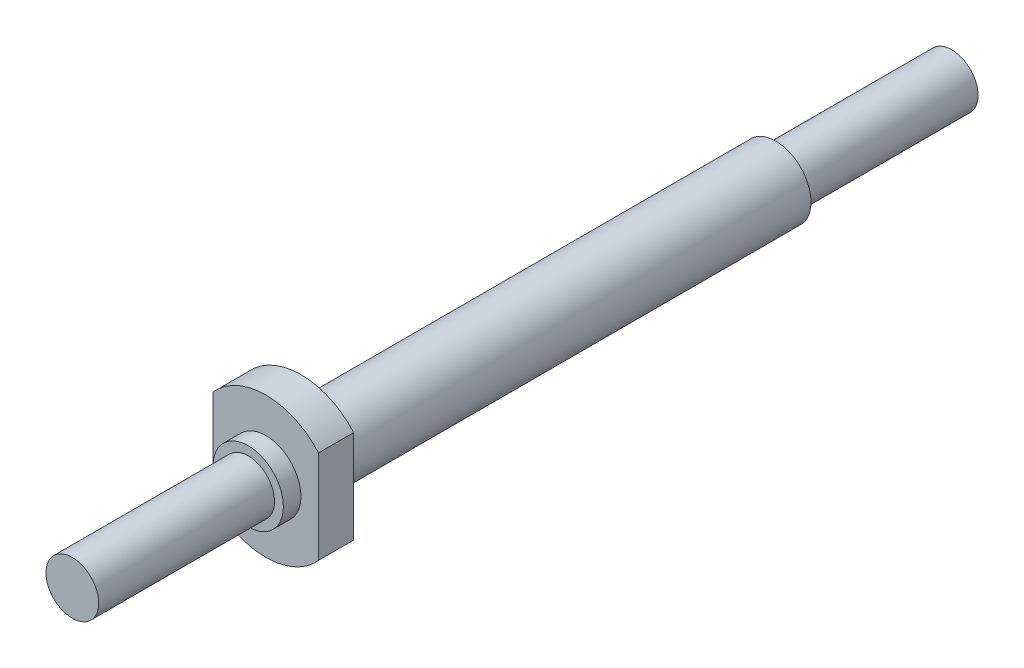
ISO-10303-21;
HEADER;
FILE_DESCRIPTION(('STEP AP214'),'2;1');
FILE_NAME('part.step','',(''),(''),'','','');
FILE_SCHEMA(('AUTOMOTIVE_DESIGN { 1 0 10303 214 1 1 1 1 }'));
ENDSEC;
DATA;
#1=APPLICATION_CONTEXT('core data for automotive mechanical design processes');
#2=APPLICATION_PROTOCOL_DEFINITION('international standard','automotive_design',2000,#1);
#3=PRODUCT_CONTEXT('',#1,'mechanical');
#4=PRODUCT('Part','Part','',(#3));
#5=PRODUCT_RELATED_PRODUCT_CATEGORY('part','',(#4));
#6=PRODUCT_DEFINITION_FORMATION('','',#4);
#7=PRODUCT_DEFINITION_CONTEXT('part definition',#1,'design');
#8=PRODUCT_DEFINITION('design','',#6,#7);
#9=PRODUCT_DEFINITION_SHAPE('','',#8);
#10=(LENGTH_UNIT() NAMED_UNIT(*) SI_UNIT(.MILLI.,.METRE.));
#11=(NAMED_UNIT(*) PLANE_ANGLE_UNIT() SI_UNIT($,.RADIAN.));
#12=(NAMED_UNIT(*) SI_UNIT($,.STERADIAN.) SOLID_ANGLE_UNIT());
#13=UNCERTAINTY_MEASURE_WITH_UNIT(LENGTH_MEASURE(1.E-05),#10,'distance_accuracy_value','');
#14=(GEOMETRIC_REPRESENTATION_CONTEXT(3) GLOBAL_UNCERTAINTY_ASSIGNED_CONTEXT((#13)) GLOBAL_UNIT_ASSIGNED_CONTEXT((#10,
#11,#12)) REPRESENTATION_CONTEXT('',''));
#15=CARTESIAN_POINT('',(0.,0.,0.));
#16=DIRECTION('',(0.,0.,1.));
#17=DIRECTION('',(1.,0.,0.));
#18=AXIS2_PLACEMENT_3D('',#15,#16,#17);
#19=CARTESIAN_POINT('',(0.,0.,-27.));
#20=DIRECTION('',(0.,0.,-1.));
#21=DIRECTION('',(-1.,0.,0.));
#22=AXIS2_PLACEMENT_3D('',#19,#20,#21);
#23=PLANE('',#22);
#24=CARTESIAN_POINT('',(0.,0.,-27.));
#25=DIRECTION('',(0.,0.,-1.));
#26=DIRECTION('',(-1.,0.,0.));
#27=AXIS2_PLACEMENT_3D('',#24,#25,#26);
#28=CIRCLE('',#27,2.);
#29=CARTESIAN_POINT('',(-2.,0.,-27.));
#30=VERTEX_POINT('',#29);
#31=EDGE_CURVE('E154',#30,#30,#28,.T.);
#32=ORIENTED_EDGE('',*,*,#31,.T.);
#33=EDGE_LOOP('',(#32));
#34=FACE_BOUND('',#33,.T.);
#35=CARTESIAN_POINT('',(0.,0.,-27.));
#36=DIRECTION('',(0.,0.,-1.));
#37=DIRECTION('',(-1.,0.,0.));
#38=AXIS2_PLACEMENT_3D('',#35,#36,#37);
#39=CIRCLE('',#38,1.5);
#40=CARTESIAN_POINT('',(-1.5,0.,-27.));
#41=VERTEX_POINT('',#40);
#42=EDGE_CURVE('E155',#41,#41,#39,.T.);
#43=ORIENTED_EDGE('',*,*,#42,.F.);
#44=EDGE_LOOP('',(#43));
#45=FACE_BOUND('',#44,.T.);
#46=ADVANCED_FACE('F36',(#34,#45),#23,.T.);
#47=CARTESIAN_POINT('',(0.,0.,0.));
#48=DIRECTION('',(0.,0.,1.));
#49=DIRECTION('',(1.,0.,0.));
#50=AXIS2_PLACEMENT_3D('',#47,#48,#49);
#51=PLANE('',#50);
#52=CARTESIAN_POINT('',(0.,0.,0.));
#53=DIRECTION('',(0.,0.,1.));
#54=DIRECTION('',(1.,0.,0.));
#55=AXIS2_PLACEMENT_3D('',#52,#53,#54);
#56=CIRCLE('',#55,4.);
#57=CARTESIAN_POINT('',(3.,2.64575131106459,0.));
#58=VERTEX_POINT('',#57);
#59=CARTESIAN_POINT('',(-3.,2.64575131106459,0.));
#60=VERTEX_POINT('',#59);
#61=EDGE_CURVE('E104',#58,#60,#56,.T.);
#62=ORIENTED_EDGE('',*,*,#61,.F.);
#63=DIRECTION('',(0.,1.,0.));
#64=VECTOR('',#63,1.);
#65=CARTESIAN_POINT('',(3.,2.64575131106459,0.));
#66=LINE('',#65,#64);
#67=CARTESIAN_POINT('',(3.,-2.64575131106459,0.));
#68=VERTEX_POINT('',#67);
#69=EDGE_CURVE('E76',#68,#58,#66,.T.);
#70=ORIENTED_EDGE('',*,*,#69,.F.);
#71=CARTESIAN_POINT('',(0.,0.,0.));
#72=DIRECTION('',(0.,0.,1.));
#73=DIRECTION('',(1.,0.,0.));
#74=AXIS2_PLACEMENT_3D('',#71,#72,#73);
#75=CIRCLE('',#74,4.);
#76=CARTESIAN_POINT('',(-3.,-2.64575131106459,0.));
#77=VERTEX_POINT('',#76);
#78=EDGE_CURVE('E70',#77,#68,#75,.T.);
#79=ORIENTED_EDGE('',*,*,#78,.F.);
#80=DIRECTION('',(0.,-1.,0.));
#81=VECTOR('',#80,1.);
#82=CARTESIAN_POINT('',(-3.,2.64575131106459,0.));
#83=LINE('',#82,#81);
#84=EDGE_CURVE('E95',#60,#77,#83,.T.);
#85=ORIENTED_EDGE('',*,*,#84,.F.);
#86=EDGE_LOOP('',(#62,#70,#79,#85));
#87=FACE_BOUND('',#86,.T.);
#88=CARTESIAN_POINT('',(0.,0.,0.));
#89=DIRECTION('',(0.,0.,1.));
#90=DIRECTION('',(1.,0.,0.));
#91=AXIS2_PLACEMENT_3D('',#88,#89,#90);
#92=CIRCLE('',#91,2.);
#93=CARTESIAN_POINT('',(2.,0.,0.));
#94=VERTEX_POINT('',#93);
#95=EDGE_CURVE('E11',#94,#94,#92,.F.);
#96=ORIENTED_EDGE('',*,*,#95,.F.);
#97=EDGE_LOOP('',(#96));
#98=FACE_BOUND('',#97,.T.);
#99=ADVANCED_FACE('F115',(#87,#98),#51,.F.);
#100=CARTESIAN_POINT('',(0.,0.,3.));
#101=DIRECTION('',(0.,0.,1.));
#102=DIRECTION('',(1.,0.,0.));
#103=AXIS2_PLACEMENT_3D('',#100,#101,#102);
#104=PLANE('',#103);
#105=CARTESIAN_POINT('',(0.,0.,3.));
#106=DIRECTION('',(0.,0.,1.));
#107=DIRECTION('',(1.,0.,0.));
#108=AXIS2_PLACEMENT_3D('',#105,#106,#107);
#109=CIRCLE('',#108,2.);
#110=CARTESIAN_POINT('',(2.,0.,3.));
#111=VERTEX_POINT('',#110);
#112=EDGE_CURVE('E107',#111,#111,#109,.T.);
#113=ORIENTED_EDGE('',*,*,#112,.T.);
#114=EDGE_LOOP('',(#113));
#115=FACE_BOUND('',#114,.T.);
#116=CARTESIAN_POINT('',(0.,0.,3.));
#117=DIRECTION('',(0.,0.,1.));
#118=DIRECTION('',(1.,0.,0.));
#119=AXIS2_PLACEMENT_3D('',#116,#117,#118);
#120=CIRCLE('',#119,1.5);
#121=CARTESIAN_POINT('',(1.5,0.,3.));
#122=VERTEX_POINT('',#121);
#123=EDGE_CURVE('E157',#122,#122,#120,.T.);
#124=ORIENTED_EDGE('',*,*,#123,.F.);
#125=EDGE_LOOP('',(#124));
#126=FACE_BOUND('',#125,.T.);
#127=ADVANCED_FACE('F118',(#115,#126),#104,.T.);
#128=CARTESIAN_POINT('',(0.,0.,2.));
#129=DIRECTION('',(0.,0.,1.));
#130=DIRECTION('',(1.,0.,0.));
#131=AXIS2_PLACEMENT_3D('',#128,#129,#130);
#132=PLANE('',#131);
#133=CARTESIAN_POINT('',(0.,0.,2.));
#134=DIRECTION('',(0.,0.,1.));
#135=DIRECTION('',(1.,0.,0.));
#136=AXIS2_PLACEMENT_3D('',#133,#134,#135);
#137=CIRCLE('',#136,4.);
#138=CARTESIAN_POINT('',(3.,2.64575131106459,2.));
#139=VERTEX_POINT('',#138);
#140=CARTESIAN_POINT('',(-3.,2.64575131106459,2.));
#141=VERTEX_POINT('',#140);
#142=EDGE_CURVE('E90',#139,#141,#137,.T.);
#143=ORIENTED_EDGE('',*,*,#142,.T.);
#144=DIRECTION('',(0.,-1.,0.));
#145=VECTOR('',#144,1.);
#146=CARTESIAN_POINT('',(-3.,2.64575131106459,2.));
#147=LINE('',#146,#145);
#148=CARTESIAN_POINT('',(-3.,-2.64575131106459,2.));
#149=VERTEX_POINT('',#148);
#150=EDGE_CURVE('E84',#141,#149,#147,.T.);
#151=ORIENTED_EDGE('',*,*,#150,.T.);
#152=CARTESIAN_POINT('',(0.,0.,2.));
#153=DIRECTION('',(0.,0.,1.));
#154=DIRECTION('',(1.,0.,0.));
#155=AXIS2_PLACEMENT_3D('',#152,#153,#154);
#156=CIRCLE('',#155,4.);
#157=CARTESIAN_POINT('',(3.,-2.64575131106459,2.));
#158=VERTEX_POINT('',#157);
#159=EDGE_CURVE('E88',#149,#158,#156,.T.);
#160=ORIENTED_EDGE('',*,*,#159,.T.);
#161=DIRECTION('',(0.,1.,0.));
#162=VECTOR('',#161,1.);
#163=CARTESIAN_POINT('',(3.,2.64575131106459,2.));
#164=LINE('',#163,#162);
#165=EDGE_CURVE('E53',#158,#139,#164,.T.);
#166=ORIENTED_EDGE('',*,*,#165,.T.);
#167=EDGE_LOOP('',(#143,#151,#160,#166));
#168=FACE_BOUND('',#167,.T.);
#169=CARTESIAN_POINT('',(0.,0.,2.));
#170=DIRECTION('',(0.,0.,1.));
#171=DIRECTION('',(1.,0.,0.));
#172=AXIS2_PLACEMENT_3D('',#169,#170,#171);
#173=CIRCLE('',#172,2.);
#174=CARTESIAN_POINT('',(2.,0.,2.));
#175=VERTEX_POINT('',#174);
#176=EDGE_CURVE('E165',#175,#175,#173,.T.);
#177=ORIENTED_EDGE('',*,*,#176,.F.);
#178=EDGE_LOOP('',(#177));
#179=FACE_BOUND('',#178,.T.);
#180=ADVANCED_FACE('F85',(#168,#179),#132,.T.);
#181=CARTESIAN_POINT('',(0.,0.,2.));
#182=DIRECTION('',(0.,0.,-1.));
#183=DIRECTION('',(-1.,0.,0.));
#184=AXIS2_PLACEMENT_3D('',#181,#182,#183);
#185=CYLINDRICAL_SURFACE('',#184,4.);
#186=ORIENTED_EDGE('',*,*,#61,.T.);
#187=DIRECTION('',(0.,0.,-1.));
#188=VECTOR('',#187,1.);
#189=CARTESIAN_POINT('',(-3.,2.64575131106459,2.));
#190=LINE('',#189,#188);
#191=EDGE_CURVE('E45',#141,#60,#190,.T.);
#192=ORIENTED_EDGE('',*,*,#191,.F.);
#193=ORIENTED_EDGE('',*,*,#142,.F.);
#194=DIRECTION('',(0.,0.,-1.));
#195=VECTOR('',#194,1.);
#196=CARTESIAN_POINT('',(3.,2.64575131106459,2.));
#197=LINE('',#196,#195);
#198=EDGE_CURVE('E100',#139,#58,#197,.T.);
#199=ORIENTED_EDGE('',*,*,#198,.T.);
#200=EDGE_LOOP('',(#186,#192,#193,#199));
#201=FACE_BOUND('',#200,.T.);
#202=ADVANCED_FACE('F38',(#201),#185,.T.);
#203=CARTESIAN_POINT('',(-3.,2.64575131106459,2.));
#204=DIRECTION('',(1.,0.,0.));
#205=DIRECTION('',(0.,0.,-1.));
#206=AXIS2_PLACEMENT_3D('',#203,#204,#205);
#207=PLANE('',#206);
#208=ORIENTED_EDGE('',*,*,#84,.T.);
#209=DIRECTION('',(0.,0.,-1.));
#210=VECTOR('',#209,1.);
#211=CARTESIAN_POINT('',(-3.,-2.64575131106459,2.));
#212=LINE('',#211,#210);
#213=EDGE_CURVE('E93',#149,#77,#212,.T.);
#214=ORIENTED_EDGE('',*,*,#213,.F.);
#215=ORIENTED_EDGE('',*,*,#150,.F.);
#216=ORIENTED_EDGE('',*,*,#191,.T.);
#217=EDGE_LOOP('',(#208,#214,#215,#216));
#218=FACE_BOUND('',#217,.T.);
#219=ADVANCED_FACE('F94',(#218),#207,.F.);
#220=CARTESIAN_POINT('',(0.,0.,2.));
#221=DIRECTION('',(0.,0.,-1.));
#222=DIRECTION('',(-1.,0.,0.));
#223=AXIS2_PLACEMENT_3D('',#220,#221,#222);
#224=CYLINDRICAL_SURFACE('',#223,4.);
#225=ORIENTED_EDGE('',*,*,#78,.T.);
#226=DIRECTION('',(0.,0.,-1.));
#227=VECTOR('',#226,1.);
#228=CARTESIAN_POINT('',(3.,-2.64575131106459,2.));
#229=LINE('',#228,#227);
#230=EDGE_CURVE('E96',#158,#68,#229,.T.);
#231=ORIENTED_EDGE('',*,*,#230,.F.);
#232=ORIENTED_EDGE('',*,*,#159,.F.);
#233=ORIENTED_EDGE('',*,*,#213,.T.);
#234=EDGE_LOOP('',(#225,#231,#232,#233));
#235=FACE_BOUND('',#234,.T.);
#236=ADVANCED_FACE('F98',(#235),#224,.T.);
#237=CARTESIAN_POINT('',(3.,2.64575131106459,2.));
#238=DIRECTION('',(-1.,0.,0.));
#239=DIRECTION('',(0.,0.,1.));
#240=AXIS2_PLACEMENT_3D('',#237,#238,#239);
#241=PLANE('',#240);
#242=ORIENTED_EDGE('',*,*,#69,.T.);
#243=ORIENTED_EDGE('',*,*,#198,.F.);
#244=ORIENTED_EDGE('',*,*,#165,.F.);
#245=ORIENTED_EDGE('',*,*,#230,.T.);
#246=EDGE_LOOP('',(#242,#243,#244,#245));
#247=FACE_BOUND('',#246,.T.);
#248=ADVANCED_FACE('F184',(#247),#241,.F.);
#249=CARTESIAN_POINT('',(0.,0.,3.));
#250=DIRECTION('',(0.,0.,-1.));
#251=DIRECTION('',(-1.,0.,0.));
#252=AXIS2_PLACEMENT_3D('',#249,#250,#251);
#253=CYLINDRICAL_SURFACE('',#252,2.);
#254=ORIENTED_EDGE('',*,*,#112,.F.);
#255=EDGE_LOOP('',(#254));
#256=FACE_BOUND('',#255,.T.);
#257=ORIENTED_EDGE('',*,*,#176,.T.);
#258=EDGE_LOOP('',(#257));
#259=FACE_BOUND('',#258,.T.);
#260=ADVANCED_FACE('F173',(#256,#259),#253,.T.);
#261=CARTESIAN_POINT('',(0.,0.,13.));
#262=DIRECTION('',(0.,0.,-1.));
#263=DIRECTION('',(-1.,0.,0.));
#264=AXIS2_PLACEMENT_3D('',#261,#262,#263);
#265=CYLINDRICAL_SURFACE('',#264,1.5);
#266=CARTESIAN_POINT('',(0.,0.,13.));
#267=DIRECTION('',(0.,0.,1.));
#268=DIRECTION('',(1.,0.,0.));
#269=AXIS2_PLACEMENT_3D('',#266,#267,#268);
#270=CIRCLE('',#269,1.5);
#271=CARTESIAN_POINT('',(1.5,0.,13.));
#272=VERTEX_POINT('',#271);
#273=EDGE_CURVE('E162',#272,#272,#270,.T.);
#274=ORIENTED_EDGE('',*,*,#273,.F.);
#275=EDGE_LOOP('',(#274));
#276=FACE_BOUND('',#275,.T.);
#277=ORIENTED_EDGE('',*,*,#123,.T.);
#278=EDGE_LOOP('',(#277));
#279=FACE_BOUND('',#278,.T.);
#280=ADVANCED_FACE('F135',(#276,#279),#265,.T.);
#281=CARTESIAN_POINT('',(0.,0.,13.));
#282=DIRECTION('',(0.,0.,1.));
#283=DIRECTION('',(1.,0.,0.));
#284=AXIS2_PLACEMENT_3D('',#281,#282,#283);
#285=PLANE('',#284);
#286=ORIENTED_EDGE('',*,*,#273,.T.);
#287=EDGE_LOOP('',(#286));
#288=FACE_BOUND('',#287,.T.);
#289=ADVANCED_FACE('F125',(#288),#285,.T.);
#290=CARTESIAN_POINT('',(0.,0.,-27.));
#291=DIRECTION('',(0.,0.,1.));
#292=DIRECTION('',(1.,0.,0.));
#293=AXIS2_PLACEMENT_3D('',#290,#291,#292);
#294=CYLINDRICAL_SURFACE('',#293,2.);
#295=ORIENTED_EDGE('',*,*,#31,.F.);
#296=EDGE_LOOP('',(#295));
#297=FACE_BOUND('',#296,.T.);
#298=ORIENTED_EDGE('',*,*,#95,.T.);
#299=EDGE_LOOP('',(#298));
#300=FACE_BOUND('',#299,.T.);
#301=ADVANCED_FACE('F122',(#297,#300),#294,.T.);
#302=CARTESIAN_POINT('',(0.,0.,-37.));
#303=DIRECTION('',(0.,0.,1.));
#304=DIRECTION('',(1.,0.,0.));
#305=AXIS2_PLACEMENT_3D('',#302,#303,#304);
#306=CYLINDRICAL_SURFACE('',#305,1.5);
#307=CARTESIAN_POINT('',(0.,0.,-37.));
#308=DIRECTION('',(0.,0.,-1.));
#309=DIRECTION('',(-1.,0.,0.));
#310=AXIS2_PLACEMENT_3D('',#307,#308,#309);
#311=CIRCLE('',#310,1.5);
#312=CARTESIAN_POINT('',(-1.5,0.,-37.));
#313=VERTEX_POINT('',#312);
#314=EDGE_CURVE('E153',#313,#313,#311,.T.);
#315=ORIENTED_EDGE('',*,*,#314,.F.);
#316=EDGE_LOOP('',(#315));
#317=FACE_BOUND('',#316,.T.);
#318=ORIENTED_EDGE('',*,*,#42,.T.);
#319=EDGE_LOOP('',(#318));
#320=FACE_BOUND('',#319,.T.);
#321=ADVANCED_FACE('F124',(#317,#320),#306,.T.);
#322=CARTESIAN_POINT('',(0.,0.,-37.));
#323=DIRECTION('',(0.,0.,-1.));
#324=DIRECTION('',(-1.,0.,0.));
#325=AXIS2_PLACEMENT_3D('',#322,#323,#324);
#326=PLANE('',#325);
#327=ORIENTED_EDGE('',*,*,#314,.T.);
#328=EDGE_LOOP('',(#327));
#329=FACE_BOUND('',#328,.T.);
#330=ADVANCED_FACE('F132',(#329),#326,.T.);
#331=CLOSED_SHELL('',(#46,#99,#127,#180,#202,#219,#236,#248,#260,#280,#289,#301,#321,#330));
#332=MANIFOLD_SOLID_BREP('B2',#331);
#333=ADVANCED_BREP_SHAPE_REPRESENTATION('',(#18,#332),#14);
#334=SHAPE_DEFINITION_REPRESENTATION(#9,#333);
ENDSEC;
END-ISO-10303-21;
